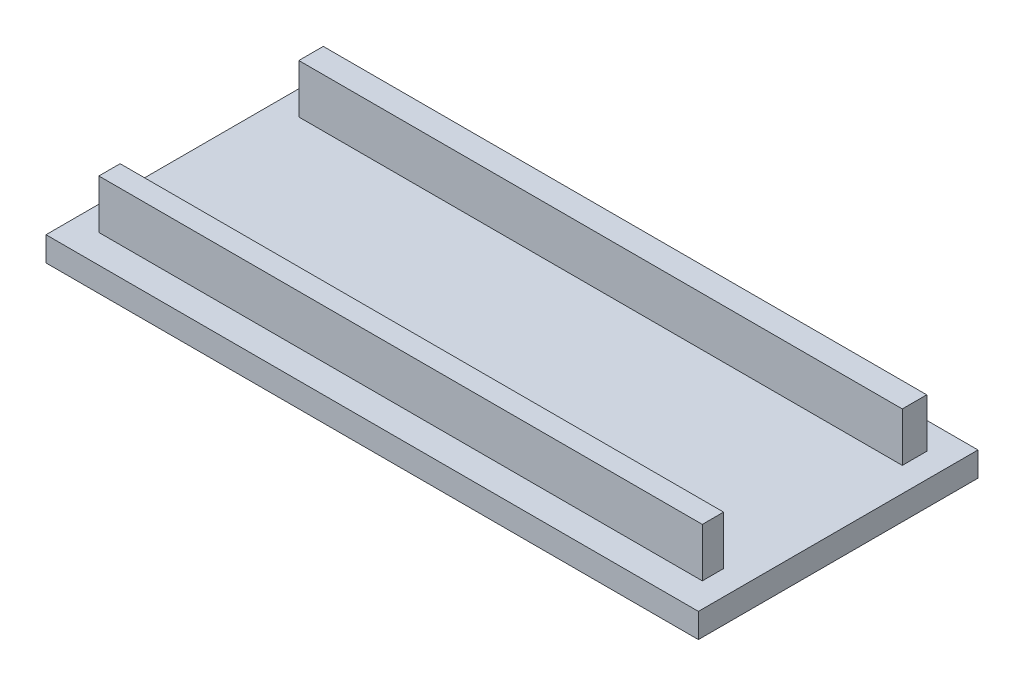
ISO-10303-21;
HEADER;
FILE_DESCRIPTION(('STEP AP214'),'2;1');
FILE_NAME('part.step','',(''),(''),'','','');
FILE_SCHEMA(('AUTOMOTIVE_DESIGN { 1 0 10303 214 1 1 1 1 }'));
ENDSEC;
DATA;
#1=APPLICATION_CONTEXT('core data for automotive mechanical design processes');
#2=APPLICATION_PROTOCOL_DEFINITION('international standard','automotive_design',2000,#1);
#3=PRODUCT_CONTEXT('',#1,'mechanical');
#4=PRODUCT('Part','Part','',(#3));
#5=PRODUCT_RELATED_PRODUCT_CATEGORY('part','',(#4));
#6=PRODUCT_DEFINITION_FORMATION('','',#4);
#7=PRODUCT_DEFINITION_CONTEXT('part definition',#1,'design');
#8=PRODUCT_DEFINITION('design','',#6,#7);
#9=PRODUCT_DEFINITION_SHAPE('','',#8);
#10=(LENGTH_UNIT() NAMED_UNIT(*) SI_UNIT(.MILLI.,.METRE.));
#11=(NAMED_UNIT(*) PLANE_ANGLE_UNIT() SI_UNIT($,.RADIAN.));
#12=(NAMED_UNIT(*) SI_UNIT($,.STERADIAN.) SOLID_ANGLE_UNIT());
#13=UNCERTAINTY_MEASURE_WITH_UNIT(LENGTH_MEASURE(1.E-05),#10,'distance_accuracy_value','');
#14=(GEOMETRIC_REPRESENTATION_CONTEXT(3) GLOBAL_UNCERTAINTY_ASSIGNED_CONTEXT((#13)) GLOBAL_UNIT_ASSIGNED_CONTEXT((#10,
#11,#12)) REPRESENTATION_CONTEXT('',''));
#15=CARTESIAN_POINT('',(0.,0.,0.));
#16=DIRECTION('',(0.,0.,1.));
#17=DIRECTION('',(1.,0.,0.));
#18=AXIS2_PLACEMENT_3D('',#15,#16,#17);
#19=CARTESIAN_POINT('',(0.,2.,0.));
#20=DIRECTION('',(0.,1.,0.));
#21=DIRECTION('',(0.,0.,1.));
#22=AXIS2_PLACEMENT_3D('',#19,#20,#21);
#23=PLANE('',#22);
#24=DIRECTION('',(0.,0.,1.));
#25=VECTOR('',#24,1.);
#26=CARTESIAN_POINT('',(-49.661513799559,2.,-4.44248494850782));
#27=LINE('',#26,#25);
#28=CARTESIAN_POINT('',(-49.661513799559,2.,-4.44248494850782));
#29=VERTEX_POINT('',#28);
#30=CARTESIAN_POINT('',(-49.661513799559,2.,18.4175150514922));
#31=VERTEX_POINT('',#30);
#32=EDGE_CURVE('E182',#29,#31,#27,.T.);
#33=ORIENTED_EDGE('',*,*,#32,.T.);
#34=DIRECTION('',(1.,0.,0.));
#35=VECTOR('',#34,1.);
#36=CARTESIAN_POINT('',(-49.661513799559,2.,18.4175150514922));
#37=LINE('',#36,#35);
#38=CARTESIAN_POINT('',(3.67848620044098,2.,18.4175150514922));
#39=VERTEX_POINT('',#38);
#40=EDGE_CURVE('E185',#31,#39,#37,.T.);
#41=ORIENTED_EDGE('',*,*,#40,.T.);
#42=DIRECTION('',(0.,0.,-1.));
#43=VECTOR('',#42,1.);
#44=CARTESIAN_POINT('',(3.67848620044098,2.,-4.44248494850782));
#45=LINE('',#44,#43);
#46=CARTESIAN_POINT('',(3.67848620044098,2.,-4.44248494850782));
#47=VERTEX_POINT('',#46);
#48=EDGE_CURVE('E188',#39,#47,#45,.T.);
#49=ORIENTED_EDGE('',*,*,#48,.T.);
#50=DIRECTION('',(-1.,0.,0.));
#51=VECTOR('',#50,1.);
#52=CARTESIAN_POINT('',(-49.661513799559,2.,-4.44248494850782));
#53=LINE('',#52,#51);
#54=EDGE_CURVE('E190',#47,#29,#53,.T.);
#55=ORIENTED_EDGE('',*,*,#54,.T.);
#56=EDGE_LOOP('',(#33,#41,#49,#55));
#57=FACE_BOUND('',#56,.T.);
#58=DIRECTION('',(1.,0.,0.));
#59=VECTOR('',#58,1.);
#60=CARTESIAN_POINT('',(1.67848620044098,2.,-0.252704327620866));
#61=LINE('',#60,#59);
#62=CARTESIAN_POINT('',(-47.661513799559,2.,-0.252704327620847));
#63=VERTEX_POINT('',#62);
#64=CARTESIAN_POINT('',(1.67848620044098,2.,-0.252704327620866));
#65=VERTEX_POINT('',#64);
#66=EDGE_CURVE('E153',#63,#65,#61,.T.);
#67=ORIENTED_EDGE('',*,*,#66,.F.);
#68=DIRECTION('',(0.,0.,1.));
#69=VECTOR('',#68,1.);
#70=CARTESIAN_POINT('',(-47.661513799559,2.,-0.252704327620847));
#71=LINE('',#70,#69);
#72=CARTESIAN_POINT('',(-47.661513799559,2.,-2.25270432762085));
#73=VERTEX_POINT('',#72);
#74=EDGE_CURVE('E150',#73,#63,#71,.T.);
#75=ORIENTED_EDGE('',*,*,#74,.F.);
#76=DIRECTION('',(-1.,0.,0.));
#77=VECTOR('',#76,1.);
#78=CARTESIAN_POINT('',(-47.661513799559,2.,-2.25270432762085));
#79=LINE('',#78,#77);
#80=CARTESIAN_POINT('',(1.67848620044098,2.,-2.25270432762085));
#81=VERTEX_POINT('',#80);
#82=EDGE_CURVE('E162',#81,#73,#79,.T.);
#83=ORIENTED_EDGE('',*,*,#82,.F.);
#84=DIRECTION('',(0.,0.,-1.));
#85=VECTOR('',#84,1.);
#86=CARTESIAN_POINT('',(1.67848620044098,2.,-2.25270432762085));
#87=LINE('',#86,#85);
#88=EDGE_CURVE('E170',#65,#81,#87,.T.);
#89=ORIENTED_EDGE('',*,*,#88,.F.);
#90=EDGE_LOOP('',(#67,#75,#83,#89));
#91=FACE_BOUND('',#90,.T.);
#92=DIRECTION('',(-1.,0.,0.));
#93=VECTOR('',#92,1.);
#94=CARTESIAN_POINT('',(1.67848620044098,2.,14.3580255510719));
#95=LINE('',#94,#93);
#96=CARTESIAN_POINT('',(1.67848620044098,2.,14.3580255510719));
#97=VERTEX_POINT('',#96);
#98=CARTESIAN_POINT('',(-47.661513799559,2.,14.358025551072));
#99=VERTEX_POINT('',#98);
#100=EDGE_CURVE('E371',#97,#99,#95,.T.);
#101=ORIENTED_EDGE('',*,*,#100,.F.);
#102=DIRECTION('',(0.,0.,-1.));
#103=VECTOR('',#102,1.);
#104=CARTESIAN_POINT('',(1.67848620044098,2.,16.0974433101385));
#105=LINE('',#104,#103);
#106=CARTESIAN_POINT('',(1.67848620044098,2.,16.0974433101385));
#107=VERTEX_POINT('',#106);
#108=EDGE_CURVE('E148',#107,#97,#105,.T.);
#109=ORIENTED_EDGE('',*,*,#108,.F.);
#110=DIRECTION('',(1.,0.,0.));
#111=VECTOR('',#110,1.);
#112=CARTESIAN_POINT('',(-47.661513799559,2.,16.0974433101385));
#113=LINE('',#112,#111);
#114=CARTESIAN_POINT('',(-47.661513799559,2.,16.0974433101385));
#115=VERTEX_POINT('',#114);
#116=EDGE_CURVE('E144',#115,#107,#113,.T.);
#117=ORIENTED_EDGE('',*,*,#116,.F.);
#118=DIRECTION('',(0.,0.,1.));
#119=VECTOR('',#118,1.);
#120=CARTESIAN_POINT('',(-47.661513799559,2.,14.358025551072));
#121=LINE('',#120,#119);
#122=EDGE_CURVE('E368',#99,#115,#121,.T.);
#123=ORIENTED_EDGE('',*,*,#122,.F.);
#124=EDGE_LOOP('',(#101,#109,#117,#123));
#125=FACE_BOUND('',#124,.T.);
#126=ADVANCED_FACE('F35',(#57,#91,#125),#23,.T.);
#127=CARTESIAN_POINT('',(-49.661513799559,2.,-4.44248494850782));
#128=DIRECTION('',(1.,0.,0.));
#129=DIRECTION('',(0.,0.,-1.));
#130=AXIS2_PLACEMENT_3D('',#127,#128,#129);
#131=PLANE('',#130);
#132=DIRECTION('',(0.,0.,1.));
#133=VECTOR('',#132,1.);
#134=CARTESIAN_POINT('',(-49.661513799559,0.,-4.44248494850782));
#135=LINE('',#134,#133);
#136=CARTESIAN_POINT('',(-49.661513799559,0.,-4.44248494850782));
#137=VERTEX_POINT('',#136);
#138=CARTESIAN_POINT('',(-49.661513799559,0.,18.4175150514922));
#139=VERTEX_POINT('',#138);
#140=EDGE_CURVE('E181',#137,#139,#135,.T.);
#141=ORIENTED_EDGE('',*,*,#140,.T.);
#142=DIRECTION('',(0.,-1.,0.));
#143=VECTOR('',#142,1.);
#144=CARTESIAN_POINT('',(-49.661513799559,2.,18.4175150514922));
#145=LINE('',#144,#143);
#146=EDGE_CURVE('E11',#31,#139,#145,.T.);
#147=ORIENTED_EDGE('',*,*,#146,.F.);
#148=ORIENTED_EDGE('',*,*,#32,.F.);
#149=DIRECTION('',(0.,-1.,0.));
#150=VECTOR('',#149,1.);
#151=CARTESIAN_POINT('',(-49.661513799559,2.,-4.44248494850782));
#152=LINE('',#151,#150);
#153=EDGE_CURVE('E192',#29,#137,#152,.T.);
#154=ORIENTED_EDGE('',*,*,#153,.T.);
#155=EDGE_LOOP('',(#141,#147,#148,#154));
#156=FACE_BOUND('',#155,.T.);
#157=ADVANCED_FACE('F37',(#156),#131,.F.);
#158=CARTESIAN_POINT('',(-49.661513799559,2.,18.4175150514922));
#159=DIRECTION('',(0.,0.,-1.));
#160=DIRECTION('',(-1.,0.,0.));
#161=AXIS2_PLACEMENT_3D('',#158,#159,#160);
#162=PLANE('',#161);
#163=DIRECTION('',(1.,0.,0.));
#164=VECTOR('',#163,1.);
#165=CARTESIAN_POINT('',(-49.661513799559,0.,18.4175150514922));
#166=LINE('',#165,#164);
#167=CARTESIAN_POINT('',(3.67848620044098,0.,18.4175150514922));
#168=VERTEX_POINT('',#167);
#169=EDGE_CURVE('E195',#139,#168,#166,.T.);
#170=ORIENTED_EDGE('',*,*,#169,.T.);
#171=DIRECTION('',(0.,-1.,0.));
#172=VECTOR('',#171,1.);
#173=CARTESIAN_POINT('',(3.67848620044098,2.,18.4175150514922));
#174=LINE('',#173,#172);
#175=EDGE_CURVE('E43',#39,#168,#174,.T.);
#176=ORIENTED_EDGE('',*,*,#175,.F.);
#177=ORIENTED_EDGE('',*,*,#40,.F.);
#178=ORIENTED_EDGE('',*,*,#146,.T.);
#179=EDGE_LOOP('',(#170,#176,#177,#178));
#180=FACE_BOUND('',#179,.T.);
#181=ADVANCED_FACE('F225',(#180),#162,.F.);
#182=CARTESIAN_POINT('',(3.67848620044098,2.,-4.44248494850782));
#183=DIRECTION('',(-1.,0.,0.));
#184=DIRECTION('',(0.,0.,1.));
#185=AXIS2_PLACEMENT_3D('',#182,#183,#184);
#186=PLANE('',#185);
#187=DIRECTION('',(0.,0.,-1.));
#188=VECTOR('',#187,1.);
#189=CARTESIAN_POINT('',(3.67848620044098,0.,-4.44248494850782));
#190=LINE('',#189,#188);
#191=CARTESIAN_POINT('',(3.67848620044098,0.,-4.44248494850782));
#192=VERTEX_POINT('',#191);
#193=EDGE_CURVE('E197',#168,#192,#190,.T.);
#194=ORIENTED_EDGE('',*,*,#193,.T.);
#195=DIRECTION('',(0.,-1.,0.));
#196=VECTOR('',#195,1.);
#197=CARTESIAN_POINT('',(3.67848620044098,2.,-4.44248494850782));
#198=LINE('',#197,#196);
#199=EDGE_CURVE('E202',#47,#192,#198,.T.);
#200=ORIENTED_EDGE('',*,*,#199,.F.);
#201=ORIENTED_EDGE('',*,*,#48,.F.);
#202=ORIENTED_EDGE('',*,*,#175,.T.);
#203=EDGE_LOOP('',(#194,#200,#201,#202));
#204=FACE_BOUND('',#203,.T.);
#205=ADVANCED_FACE('F209',(#204),#186,.F.);
#206=CARTESIAN_POINT('',(-49.661513799559,2.,-4.44248494850782));
#207=DIRECTION('',(0.,0.,1.));
#208=DIRECTION('',(1.,0.,0.));
#209=AXIS2_PLACEMENT_3D('',#206,#207,#208);
#210=PLANE('',#209);
#211=DIRECTION('',(-1.,0.,0.));
#212=VECTOR('',#211,1.);
#213=CARTESIAN_POINT('',(-49.661513799559,0.,-4.44248494850782));
#214=LINE('',#213,#212);
#215=EDGE_CURVE('E186',#192,#137,#214,.T.);
#216=ORIENTED_EDGE('',*,*,#215,.T.);
#217=ORIENTED_EDGE('',*,*,#153,.F.);
#218=ORIENTED_EDGE('',*,*,#54,.F.);
#219=ORIENTED_EDGE('',*,*,#199,.T.);
#220=EDGE_LOOP('',(#216,#217,#218,#219));
#221=FACE_BOUND('',#220,.T.);
#222=ADVANCED_FACE('F218',(#221),#210,.F.);
#223=CARTESIAN_POINT('',(0.,0.,0.));
#224=DIRECTION('',(0.,1.,0.));
#225=DIRECTION('',(0.,0.,1.));
#226=AXIS2_PLACEMENT_3D('',#223,#224,#225);
#227=PLANE('',#226);
#228=ORIENTED_EDGE('',*,*,#140,.F.);
#229=ORIENTED_EDGE('',*,*,#215,.F.);
#230=ORIENTED_EDGE('',*,*,#193,.F.);
#231=ORIENTED_EDGE('',*,*,#169,.F.);
#232=EDGE_LOOP('',(#228,#229,#230,#231));
#233=FACE_BOUND('',#232,.T.);
#234=ADVANCED_FACE('F215',(#233),#227,.F.);
#235=CARTESIAN_POINT('',(-47.661513799559,6.,-0.252704327620847));
#236=DIRECTION('',(1.,0.,0.));
#237=DIRECTION('',(0.,0.,-1.));
#238=AXIS2_PLACEMENT_3D('',#235,#236,#237);
#239=PLANE('',#238);
#240=ORIENTED_EDGE('',*,*,#74,.T.);
#241=DIRECTION('',(0.,-1.,0.));
#242=VECTOR('',#241,1.);
#243=CARTESIAN_POINT('',(-47.661513799559,6.,-0.252704327620847));
#244=LINE('',#243,#242);
#245=CARTESIAN_POINT('',(-47.661513799559,6.,-0.252704327620847));
#246=VERTEX_POINT('',#245);
#247=EDGE_CURVE('E179',#246,#63,#244,.T.);
#248=ORIENTED_EDGE('',*,*,#247,.F.);
#249=DIRECTION('',(0.,0.,1.));
#250=VECTOR('',#249,1.);
#251=CARTESIAN_POINT('',(-47.661513799559,6.,-0.252704327620847));
#252=LINE('',#251,#250);
#253=CARTESIAN_POINT('',(-47.661513799559,6.,-2.25270432762085));
#254=VERTEX_POINT('',#253);
#255=EDGE_CURVE('E158',#254,#246,#252,.T.);
#256=ORIENTED_EDGE('',*,*,#255,.F.);
#257=DIRECTION('',(0.,-1.,0.));
#258=VECTOR('',#257,1.);
#259=CARTESIAN_POINT('',(-47.661513799559,6.,-2.25270432762085));
#260=LINE('',#259,#258);
#261=EDGE_CURVE('E167',#254,#73,#260,.T.);
#262=ORIENTED_EDGE('',*,*,#261,.T.);
#263=EDGE_LOOP('',(#240,#248,#256,#262));
#264=FACE_BOUND('',#263,.T.);
#265=ADVANCED_FACE('F238',(#264),#239,.F.);
#266=CARTESIAN_POINT('',(1.67848620044098,6.,-0.252704327620866));
#267=DIRECTION('',(0.,0.,-1.));
#268=DIRECTION('',(-1.,0.,0.));
#269=AXIS2_PLACEMENT_3D('',#266,#267,#268);
#270=PLANE('',#269);
#271=ORIENTED_EDGE('',*,*,#66,.T.);
#272=DIRECTION('',(0.,-1.,0.));
#273=VECTOR('',#272,1.);
#274=CARTESIAN_POINT('',(1.67848620044098,6.,-0.252704327620866));
#275=LINE('',#274,#273);
#276=CARTESIAN_POINT('',(1.67848620044098,6.,-0.252704327620866));
#277=VERTEX_POINT('',#276);
#278=EDGE_CURVE('E176',#277,#65,#275,.T.);
#279=ORIENTED_EDGE('',*,*,#278,.F.);
#280=DIRECTION('',(1.,0.,0.));
#281=VECTOR('',#280,1.);
#282=CARTESIAN_POINT('',(1.67848620044098,6.,-0.252704327620866));
#283=LINE('',#282,#281);
#284=EDGE_CURVE('E161',#246,#277,#283,.T.);
#285=ORIENTED_EDGE('',*,*,#284,.F.);
#286=ORIENTED_EDGE('',*,*,#247,.T.);
#287=EDGE_LOOP('',(#271,#279,#285,#286));
#288=FACE_BOUND('',#287,.T.);
#289=ADVANCED_FACE('F257',(#288),#270,.F.);
#290=CARTESIAN_POINT('',(1.67848620044098,6.,-2.25270432762085));
#291=DIRECTION('',(-1.,0.,0.));
#292=DIRECTION('',(0.,0.,1.));
#293=AXIS2_PLACEMENT_3D('',#290,#291,#292);
#294=PLANE('',#293);
#295=ORIENTED_EDGE('',*,*,#88,.T.);
#296=DIRECTION('',(0.,-1.,0.));
#297=VECTOR('',#296,1.);
#298=CARTESIAN_POINT('',(1.67848620044098,6.,-2.25270432762085));
#299=LINE('',#298,#297);
#300=CARTESIAN_POINT('',(1.67848620044098,6.,-2.25270432762085));
#301=VERTEX_POINT('',#300);
#302=EDGE_CURVE('E58',#301,#81,#299,.T.);
#303=ORIENTED_EDGE('',*,*,#302,.F.);
#304=DIRECTION('',(0.,0.,-1.));
#305=VECTOR('',#304,1.);
#306=CARTESIAN_POINT('',(1.67848620044098,6.,-2.25270432762085));
#307=LINE('',#306,#305);
#308=EDGE_CURVE('E164',#277,#301,#307,.T.);
#309=ORIENTED_EDGE('',*,*,#308,.F.);
#310=ORIENTED_EDGE('',*,*,#278,.T.);
#311=EDGE_LOOP('',(#295,#303,#309,#310));
#312=FACE_BOUND('',#311,.T.);
#313=ADVANCED_FACE('F264',(#312),#294,.F.);
#314=CARTESIAN_POINT('',(-47.661513799559,6.,-2.25270432762085));
#315=DIRECTION('',(0.,0.,1.));
#316=DIRECTION('',(1.,0.,0.));
#317=AXIS2_PLACEMENT_3D('',#314,#315,#316);
#318=PLANE('',#317);
#319=ORIENTED_EDGE('',*,*,#82,.T.);
#320=ORIENTED_EDGE('',*,*,#261,.F.);
#321=DIRECTION('',(-1.,0.,0.));
#322=VECTOR('',#321,1.);
#323=CARTESIAN_POINT('',(-47.661513799559,6.,-2.25270432762085));
#324=LINE('',#323,#322);
#325=EDGE_CURVE('E166',#301,#254,#324,.T.);
#326=ORIENTED_EDGE('',*,*,#325,.F.);
#327=ORIENTED_EDGE('',*,*,#302,.T.);
#328=EDGE_LOOP('',(#319,#320,#326,#327));
#329=FACE_BOUND('',#328,.T.);
#330=ADVANCED_FACE('F271',(#329),#318,.F.);
#331=CARTESIAN_POINT('',(0.,6.,0.));
#332=DIRECTION('',(0.,-1.,0.));
#333=DIRECTION('',(0.,0.,-1.));
#334=AXIS2_PLACEMENT_3D('',#331,#332,#333);
#335=PLANE('',#334);
#336=ORIENTED_EDGE('',*,*,#255,.T.);
#337=ORIENTED_EDGE('',*,*,#284,.T.);
#338=ORIENTED_EDGE('',*,*,#308,.T.);
#339=ORIENTED_EDGE('',*,*,#325,.T.);
#340=EDGE_LOOP('',(#336,#337,#338,#339));
#341=FACE_BOUND('',#340,.T.);
#342=ADVANCED_FACE('F279',(#341),#335,.F.);
#343=CARTESIAN_POINT('',(1.67848620044098,6.,16.0974433101385));
#344=DIRECTION('',(-1.,0.,0.));
#345=DIRECTION('',(0.,0.,1.));
#346=AXIS2_PLACEMENT_3D('',#343,#344,#345);
#347=PLANE('',#346);
#348=ORIENTED_EDGE('',*,*,#108,.T.);
#349=DIRECTION('',(0.,-1.,0.));
#350=VECTOR('',#349,1.);
#351=CARTESIAN_POINT('',(1.67848620044098,6.,14.3580255510719));
#352=LINE('',#351,#350);
#353=CARTESIAN_POINT('',(1.67848620044098,6.,14.3580255510719));
#354=VERTEX_POINT('',#353);
#355=EDGE_CURVE('E129',#354,#97,#352,.T.);
#356=ORIENTED_EDGE('',*,*,#355,.F.);
#357=DIRECTION('',(0.,0.,-1.));
#358=VECTOR('',#357,1.);
#359=CARTESIAN_POINT('',(1.67848620044098,6.,16.0974433101385));
#360=LINE('',#359,#358);
#361=CARTESIAN_POINT('',(1.67848620044098,6.,16.0974433101385));
#362=VERTEX_POINT('',#361);
#363=EDGE_CURVE('E136',#362,#354,#360,.T.);
#364=ORIENTED_EDGE('',*,*,#363,.F.);
#365=DIRECTION('',(0.,-1.,0.));
#366=VECTOR('',#365,1.);
#367=CARTESIAN_POINT('',(1.67848620044098,6.,16.0974433101385));
#368=LINE('',#367,#366);
#369=EDGE_CURVE('E365',#362,#107,#368,.T.);
#370=ORIENTED_EDGE('',*,*,#369,.T.);
#371=EDGE_LOOP('',(#348,#356,#364,#370));
#372=FACE_BOUND('',#371,.T.);
#373=ADVANCED_FACE('F146',(#372),#347,.F.);
#374=CARTESIAN_POINT('',(1.67848620044098,6.,14.3580255510719));
#375=DIRECTION('',(0.,0.,1.));
#376=DIRECTION('',(1.,0.,0.));
#377=AXIS2_PLACEMENT_3D('',#374,#375,#376);
#378=PLANE('',#377);
#379=ORIENTED_EDGE('',*,*,#100,.T.);
#380=DIRECTION('',(0.,-1.,0.));
#381=VECTOR('',#380,1.);
#382=CARTESIAN_POINT('',(-47.661513799559,6.,14.358025551072));
#383=LINE('',#382,#381);
#384=CARTESIAN_POINT('',(-47.661513799559,6.,14.358025551072));
#385=VERTEX_POINT('',#384);
#386=EDGE_CURVE('E132',#385,#99,#383,.T.);
#387=ORIENTED_EDGE('',*,*,#386,.F.);
#388=DIRECTION('',(-1.,0.,0.));
#389=VECTOR('',#388,1.);
#390=CARTESIAN_POINT('',(1.67848620044098,6.,14.3580255510719));
#391=LINE('',#390,#389);
#392=EDGE_CURVE('E125',#354,#385,#391,.T.);
#393=ORIENTED_EDGE('',*,*,#392,.F.);
#394=ORIENTED_EDGE('',*,*,#355,.T.);
#395=EDGE_LOOP('',(#379,#387,#393,#394));
#396=FACE_BOUND('',#395,.T.);
#397=ADVANCED_FACE('F127',(#396),#378,.F.);
#398=CARTESIAN_POINT('',(-47.661513799559,6.,14.358025551072));
#399=DIRECTION('',(1.,0.,0.));
#400=DIRECTION('',(0.,0.,-1.));
#401=AXIS2_PLACEMENT_3D('',#398,#399,#400);
#402=PLANE('',#401);
#403=ORIENTED_EDGE('',*,*,#122,.T.);
#404=DIRECTION('',(0.,-1.,0.));
#405=VECTOR('',#404,1.);
#406=CARTESIAN_POINT('',(-47.661513799559,6.,16.0974433101385));
#407=LINE('',#406,#405);
#408=CARTESIAN_POINT('',(-47.661513799559,6.,16.0974433101385));
#409=VERTEX_POINT('',#408);
#410=EDGE_CURVE('E50',#409,#115,#407,.T.);
#411=ORIENTED_EDGE('',*,*,#410,.F.);
#412=DIRECTION('',(0.,0.,1.));
#413=VECTOR('',#412,1.);
#414=CARTESIAN_POINT('',(-47.661513799559,6.,14.358025551072));
#415=LINE('',#414,#413);
#416=EDGE_CURVE('E135',#385,#409,#415,.T.);
#417=ORIENTED_EDGE('',*,*,#416,.F.);
#418=ORIENTED_EDGE('',*,*,#386,.T.);
#419=EDGE_LOOP('',(#403,#411,#417,#418));
#420=FACE_BOUND('',#419,.T.);
#421=ADVANCED_FACE('F299',(#420),#402,.F.);
#422=CARTESIAN_POINT('',(-47.661513799559,6.,16.0974433101385));
#423=DIRECTION('',(0.,0.,-1.));
#424=DIRECTION('',(-1.,0.,0.));
#425=AXIS2_PLACEMENT_3D('',#422,#423,#424);
#426=PLANE('',#425);
#427=ORIENTED_EDGE('',*,*,#116,.T.);
#428=ORIENTED_EDGE('',*,*,#369,.F.);
#429=DIRECTION('',(1.,0.,0.));
#430=VECTOR('',#429,1.);
#431=CARTESIAN_POINT('',(-47.661513799559,6.,16.0974433101385));
#432=LINE('',#431,#430);
#433=EDGE_CURVE('E140',#409,#362,#432,.T.);
#434=ORIENTED_EDGE('',*,*,#433,.F.);
#435=ORIENTED_EDGE('',*,*,#410,.T.);
#436=EDGE_LOOP('',(#427,#428,#434,#435));
#437=FACE_BOUND('',#436,.T.);
#438=ADVANCED_FACE('F306',(#437),#426,.F.);
#439=CARTESIAN_POINT('',(0.,6.,0.));
#440=DIRECTION('',(0.,1.,0.));
#441=DIRECTION('',(0.,0.,1.));
#442=AXIS2_PLACEMENT_3D('',#439,#440,#441);
#443=PLANE('',#442);
#444=ORIENTED_EDGE('',*,*,#363,.T.);
#445=ORIENTED_EDGE('',*,*,#392,.T.);
#446=ORIENTED_EDGE('',*,*,#416,.T.);
#447=ORIENTED_EDGE('',*,*,#433,.T.);
#448=EDGE_LOOP('',(#444,#445,#446,#447));
#449=FACE_BOUND('',#448,.T.);
#450=ADVANCED_FACE('F139',(#449),#443,.T.);
#451=CLOSED_SHELL('',(#126,#157,#181,#205,#222,#234,#265,#289,#313,#330,#342,#373,#397,#421,
#438,#450));
#452=MANIFOLD_SOLID_BREP('B2',#451);
#453=ADVANCED_BREP_SHAPE_REPRESENTATION('',(#18,#452),#14);
#454=SHAPE_DEFINITION_REPRESENTATION(#9,#453);
ENDSEC;
END-ISO-10303-21;
